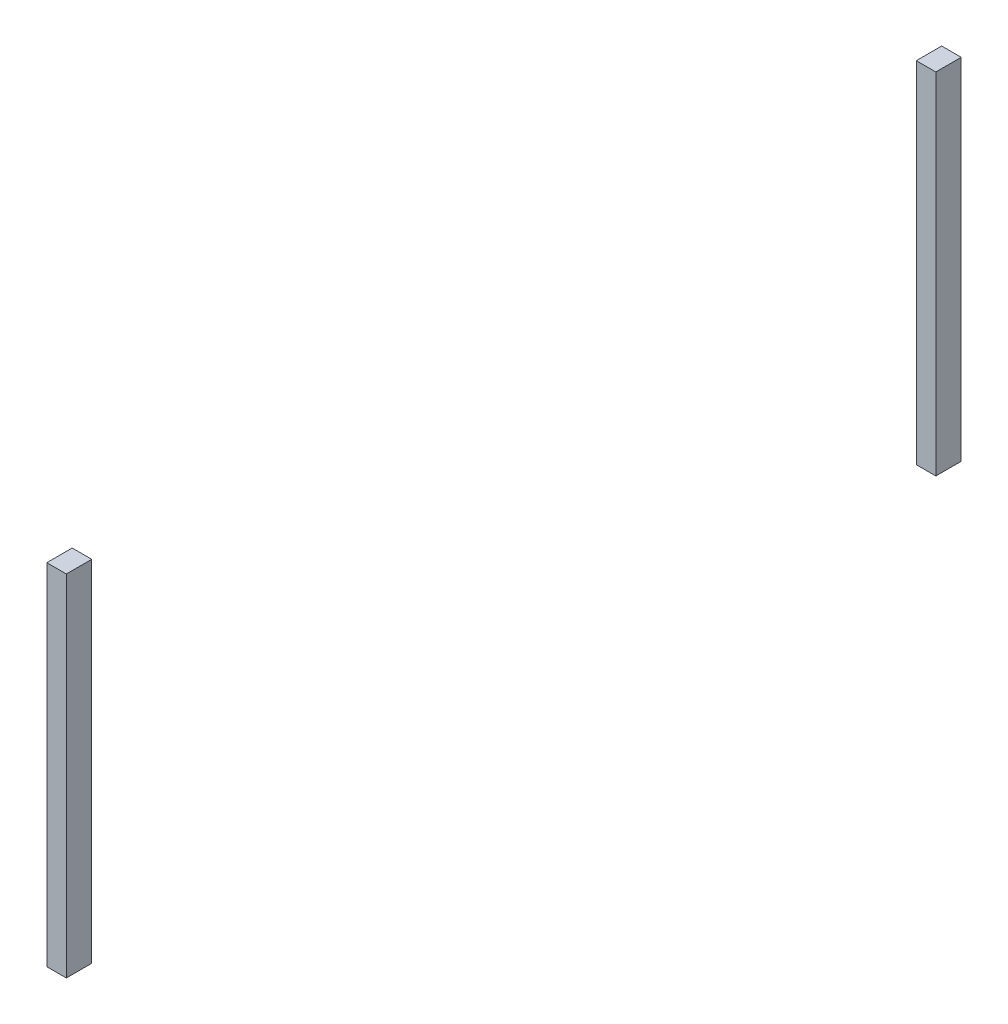
ISO-10303-21;
HEADER;
FILE_DESCRIPTION(('STEP AP214'),'2;1');
FILE_NAME('part.step','',(''),(''),'','','');
FILE_SCHEMA(('AUTOMOTIVE_DESIGN { 1 0 10303 214 1 1 1 1 }'));
ENDSEC;
DATA;
#1=APPLICATION_CONTEXT('core data for automotive mechanical design processes');
#2=APPLICATION_PROTOCOL_DEFINITION('international standard','automotive_design',2000,#1);
#3=PRODUCT_CONTEXT('',#1,'mechanical');
#4=PRODUCT('Part','Part','',(#3));
#5=PRODUCT_RELATED_PRODUCT_CATEGORY('part','',(#4));
#6=PRODUCT_DEFINITION_FORMATION('','',#4);
#7=PRODUCT_DEFINITION_CONTEXT('part definition',#1,'design');
#8=PRODUCT_DEFINITION('design','',#6,#7);
#9=PRODUCT_DEFINITION_SHAPE('','',#8);
#10=(LENGTH_UNIT() NAMED_UNIT(*) SI_UNIT(.MILLI.,.METRE.));
#11=(NAMED_UNIT(*) PLANE_ANGLE_UNIT() SI_UNIT($,.RADIAN.));
#12=(NAMED_UNIT(*) SI_UNIT($,.STERADIAN.) SOLID_ANGLE_UNIT());
#13=UNCERTAINTY_MEASURE_WITH_UNIT(LENGTH_MEASURE(1.E-05),#10,'distance_accuracy_value','');
#14=(GEOMETRIC_REPRESENTATION_CONTEXT(3) GLOBAL_UNCERTAINTY_ASSIGNED_CONTEXT((#13)) GLOBAL_UNIT_ASSIGNED_CONTEXT((#10,
#11,#12)) REPRESENTATION_CONTEXT('',''));
#15=CARTESIAN_POINT('',(0.,0.,0.));
#16=DIRECTION('',(0.,0.,1.));
#17=DIRECTION('',(1.,0.,0.));
#18=AXIS2_PLACEMENT_3D('',#15,#16,#17);
#19=CARTESIAN_POINT('',(287.55,151.,601.6));
#20=DIRECTION('',(0.,1.,0.));
#21=DIRECTION('',(0.,0.,1.));
#22=AXIS2_PLACEMENT_3D('',#19,#20,#21);
#23=PLANE('',#22);
#24=DIRECTION('',(0.,0.,-1.));
#25=VECTOR('',#24,1.);
#26=CARTESIAN_POINT('',(256.75,151.,601.6));
#27=LINE('',#26,#25);
#28=CARTESIAN_POINT('',(256.75,151.,601.6));
#29=VERTEX_POINT('',#28);
#30=CARTESIAN_POINT('',(256.75,151.,561.6));
#31=VERTEX_POINT('',#30);
#32=EDGE_CURVE('E106',#29,#31,#27,.T.);
#33=ORIENTED_EDGE('',*,*,#32,.F.);
#34=DIRECTION('',(-1.,0.,0.));
#35=VECTOR('',#34,1.);
#36=CARTESIAN_POINT('',(287.55,151.,601.6));
#37=LINE('',#36,#35);
#38=CARTESIAN_POINT('',(287.55,151.,601.6));
#39=VERTEX_POINT('',#38);
#40=EDGE_CURVE('E12',#39,#29,#37,.T.);
#41=ORIENTED_EDGE('',*,*,#40,.F.);
#42=DIRECTION('',(0.,0.,-1.));
#43=VECTOR('',#42,1.);
#44=CARTESIAN_POINT('',(287.55,151.,601.6));
#45=LINE('',#44,#43);
#46=CARTESIAN_POINT('',(287.55,151.,561.6));
#47=VERTEX_POINT('',#46);
#48=EDGE_CURVE('E100',#39,#47,#45,.T.);
#49=ORIENTED_EDGE('',*,*,#48,.T.);
#50=DIRECTION('',(-1.,0.,0.));
#51=VECTOR('',#50,1.);
#52=CARTESIAN_POINT('',(287.55,151.,561.6));
#53=LINE('',#52,#51);
#54=EDGE_CURVE('E45',#47,#31,#53,.T.);
#55=ORIENTED_EDGE('',*,*,#54,.T.);
#56=EDGE_LOOP('',(#33,#41,#49,#55));
#57=FACE_BOUND('',#56,.T.);
#58=ADVANCED_FACE('F42',(#57),#23,.T.);
#59=CARTESIAN_POINT('',(287.55,-400.,601.6));
#60=DIRECTION('',(0.,0.,1.));
#61=DIRECTION('',(1.,0.,0.));
#62=AXIS2_PLACEMENT_3D('',#59,#60,#61);
#63=PLANE('',#62);
#64=DIRECTION('',(0.,1.,0.));
#65=VECTOR('',#64,1.);
#66=CARTESIAN_POINT('',(256.75,-400.,601.6));
#67=LINE('',#66,#65);
#68=CARTESIAN_POINT('',(256.75,-400.,601.6));
#69=VERTEX_POINT('',#68);
#70=EDGE_CURVE('E102',#69,#29,#67,.T.);
#71=ORIENTED_EDGE('',*,*,#70,.F.);
#72=DIRECTION('',(-1.,0.,0.));
#73=VECTOR('',#72,1.);
#74=CARTESIAN_POINT('',(287.55,-400.,601.6));
#75=LINE('',#74,#73);
#76=CARTESIAN_POINT('',(287.55,-400.,601.6));
#77=VERTEX_POINT('',#76);
#78=EDGE_CURVE('E51',#77,#69,#75,.T.);
#79=ORIENTED_EDGE('',*,*,#78,.F.);
#80=DIRECTION('',(0.,1.,0.));
#81=VECTOR('',#80,1.);
#82=CARTESIAN_POINT('',(287.55,-400.,601.6));
#83=LINE('',#82,#81);
#84=EDGE_CURVE('E97',#77,#39,#83,.T.);
#85=ORIENTED_EDGE('',*,*,#84,.T.);
#86=ORIENTED_EDGE('',*,*,#40,.T.);
#87=EDGE_LOOP('',(#71,#79,#85,#86));
#88=FACE_BOUND('',#87,.T.);
#89=ADVANCED_FACE('F116',(#88),#63,.T.);
#90=CARTESIAN_POINT('',(287.55,-400.,561.6));
#91=DIRECTION('',(0.,-1.,0.));
#92=DIRECTION('',(0.,0.,-1.));
#93=AXIS2_PLACEMENT_3D('',#90,#91,#92);
#94=PLANE('',#93);
#95=DIRECTION('',(0.,0.,1.));
#96=VECTOR('',#95,1.);
#97=CARTESIAN_POINT('',(256.75,-400.,561.6));
#98=LINE('',#97,#96);
#99=CARTESIAN_POINT('',(256.75,-400.,561.6));
#100=VERTEX_POINT('',#99);
#101=EDGE_CURVE('E92',#100,#69,#98,.T.);
#102=ORIENTED_EDGE('',*,*,#101,.F.);
#103=DIRECTION('',(-1.,0.,0.));
#104=VECTOR('',#103,1.);
#105=CARTESIAN_POINT('',(287.55,-400.,561.6));
#106=LINE('',#105,#104);
#107=CARTESIAN_POINT('',(287.55,-400.,561.6));
#108=VERTEX_POINT('',#107);
#109=EDGE_CURVE('E87',#108,#100,#106,.T.);
#110=ORIENTED_EDGE('',*,*,#109,.F.);
#111=DIRECTION('',(0.,0.,1.));
#112=VECTOR('',#111,1.);
#113=CARTESIAN_POINT('',(287.55,-400.,561.6));
#114=LINE('',#113,#112);
#115=EDGE_CURVE('E90',#108,#77,#114,.T.);
#116=ORIENTED_EDGE('',*,*,#115,.T.);
#117=ORIENTED_EDGE('',*,*,#78,.T.);
#118=EDGE_LOOP('',(#102,#110,#116,#117));
#119=FACE_BOUND('',#118,.T.);
#120=ADVANCED_FACE('F89',(#119),#94,.T.);
#121=CARTESIAN_POINT('',(287.55,151.,561.6));
#122=DIRECTION('',(0.,0.,-1.));
#123=DIRECTION('',(-1.,0.,0.));
#124=AXIS2_PLACEMENT_3D('',#121,#122,#123);
#125=PLANE('',#124);
#126=DIRECTION('',(0.,-1.,0.));
#127=VECTOR('',#126,1.);
#128=CARTESIAN_POINT('',(256.75,151.,561.6));
#129=LINE('',#128,#127);
#130=EDGE_CURVE('E109',#31,#100,#129,.T.);
#131=ORIENTED_EDGE('',*,*,#130,.F.);
#132=ORIENTED_EDGE('',*,*,#54,.F.);
#133=DIRECTION('',(0.,-1.,0.));
#134=VECTOR('',#133,1.);
#135=CARTESIAN_POINT('',(287.55,151.,561.6));
#136=LINE('',#135,#134);
#137=EDGE_CURVE('E96',#47,#108,#136,.T.);
#138=ORIENTED_EDGE('',*,*,#137,.T.);
#139=ORIENTED_EDGE('',*,*,#109,.T.);
#140=EDGE_LOOP('',(#131,#132,#138,#139));
#141=FACE_BOUND('',#140,.T.);
#142=ADVANCED_FACE('F99',(#141),#125,.T.);
#143=CARTESIAN_POINT('',(287.55,0.,0.));
#144=DIRECTION('',(-1.,0.,0.));
#145=DIRECTION('',(0.,0.,1.));
#146=AXIS2_PLACEMENT_3D('',#143,#144,#145);
#147=PLANE('',#146);
#148=ORIENTED_EDGE('',*,*,#48,.F.);
#149=ORIENTED_EDGE('',*,*,#84,.F.);
#150=ORIENTED_EDGE('',*,*,#115,.F.);
#151=ORIENTED_EDGE('',*,*,#137,.F.);
#152=EDGE_LOOP('',(#148,#149,#150,#151));
#153=FACE_BOUND('',#152,.T.);
#154=ADVANCED_FACE('F95',(#153),#147,.F.);
#155=CARTESIAN_POINT('',(256.75,0.,0.));
#156=DIRECTION('',(-1.,0.,0.));
#157=DIRECTION('',(0.,0.,1.));
#158=AXIS2_PLACEMENT_3D('',#155,#156,#157);
#159=PLANE('',#158);
#160=ORIENTED_EDGE('',*,*,#32,.T.);
#161=ORIENTED_EDGE('',*,*,#130,.T.);
#162=ORIENTED_EDGE('',*,*,#101,.T.);
#163=ORIENTED_EDGE('',*,*,#70,.T.);
#164=EDGE_LOOP('',(#160,#161,#162,#163));
#165=FACE_BOUND('',#164,.T.);
#166=ADVANCED_FACE('F115',(#165),#159,.T.);
#167=CLOSED_SHELL('',(#58,#89,#120,#142,#154,#166));
#168=MANIFOLD_SOLID_BREP('B2',#167);
#169=CARTESIAN_POINT('',(287.55,-400.,1970.8));
#170=DIRECTION('',(0.,0.,1.));
#171=DIRECTION('',(1.,0.,0.));
#172=AXIS2_PLACEMENT_3D('',#169,#170,#171);
#173=PLANE('',#172);
#174=DIRECTION('',(0.,1.,0.));
#175=VECTOR('',#174,1.);
#176=CARTESIAN_POINT('',(256.75,-400.,1970.8));
#177=LINE('',#176,#175);
#178=CARTESIAN_POINT('',(256.75,-400.,1970.8));
#179=VERTEX_POINT('',#178);
#180=CARTESIAN_POINT('',(256.75,151.,1970.8));
#181=VERTEX_POINT('',#180);
#182=EDGE_CURVE('E229',#179,#181,#177,.T.);
#183=ORIENTED_EDGE('',*,*,#182,.F.);
#184=DIRECTION('',(-1.,0.,0.));
#185=VECTOR('',#184,1.);
#186=CARTESIAN_POINT('',(287.55,-400.,1970.8));
#187=LINE('',#186,#185);
#188=CARTESIAN_POINT('',(287.55,-400.,1970.8));
#189=VERTEX_POINT('',#188);
#190=EDGE_CURVE('E40',#189,#179,#187,.T.);
#191=ORIENTED_EDGE('',*,*,#190,.F.);
#192=DIRECTION('',(0.,1.,0.));
#193=VECTOR('',#192,1.);
#194=CARTESIAN_POINT('',(287.55,-400.,1970.8));
#195=LINE('',#194,#193);
#196=CARTESIAN_POINT('',(287.55,151.,1970.8));
#197=VERTEX_POINT('',#196);
#198=EDGE_CURVE('E223',#189,#197,#195,.T.);
#199=ORIENTED_EDGE('',*,*,#198,.T.);
#200=DIRECTION('',(-1.,0.,0.));
#201=VECTOR('',#200,1.);
#202=CARTESIAN_POINT('',(287.55,151.,1970.8));
#203=LINE('',#202,#201);
#204=EDGE_CURVE('E168',#197,#181,#203,.T.);
#205=ORIENTED_EDGE('',*,*,#204,.T.);
#206=EDGE_LOOP('',(#183,#191,#199,#205));
#207=FACE_BOUND('',#206,.T.);
#208=ADVANCED_FACE('F165',(#207),#173,.T.);
#209=CARTESIAN_POINT('',(287.55,-400.,1930.8));
#210=DIRECTION('',(0.,-1.,0.));
#211=DIRECTION('',(0.,0.,-1.));
#212=AXIS2_PLACEMENT_3D('',#209,#210,#211);
#213=PLANE('',#212);
#214=DIRECTION('',(0.,0.,1.));
#215=VECTOR('',#214,1.);
#216=CARTESIAN_POINT('',(256.75,-400.,1930.8));
#217=LINE('',#216,#215);
#218=CARTESIAN_POINT('',(256.75,-400.,1930.8));
#219=VERTEX_POINT('',#218);
#220=EDGE_CURVE('E225',#219,#179,#217,.T.);
#221=ORIENTED_EDGE('',*,*,#220,.F.);
#222=DIRECTION('',(-1.,0.,0.));
#223=VECTOR('',#222,1.);
#224=CARTESIAN_POINT('',(287.55,-400.,1930.8));
#225=LINE('',#224,#223);
#226=CARTESIAN_POINT('',(287.55,-400.,1930.8));
#227=VERTEX_POINT('',#226);
#228=EDGE_CURVE('E174',#227,#219,#225,.T.);
#229=ORIENTED_EDGE('',*,*,#228,.F.);
#230=DIRECTION('',(0.,0.,1.));
#231=VECTOR('',#230,1.);
#232=CARTESIAN_POINT('',(287.55,-400.,1930.8));
#233=LINE('',#232,#231);
#234=EDGE_CURVE('E220',#227,#189,#233,.T.);
#235=ORIENTED_EDGE('',*,*,#234,.T.);
#236=ORIENTED_EDGE('',*,*,#190,.T.);
#237=EDGE_LOOP('',(#221,#229,#235,#236));
#238=FACE_BOUND('',#237,.T.);
#239=ADVANCED_FACE('F239',(#238),#213,.T.);
#240=CARTESIAN_POINT('',(287.55,151.,1930.8));
#241=DIRECTION('',(0.,0.,-1.));
#242=DIRECTION('',(-1.,0.,0.));
#243=AXIS2_PLACEMENT_3D('',#240,#241,#242);
#244=PLANE('',#243);
#245=DIRECTION('',(0.,-1.,0.));
#246=VECTOR('',#245,1.);
#247=CARTESIAN_POINT('',(256.75,151.,1930.8));
#248=LINE('',#247,#246);
#249=CARTESIAN_POINT('',(256.75,151.,1930.8));
#250=VERTEX_POINT('',#249);
#251=EDGE_CURVE('E215',#250,#219,#248,.T.);
#252=ORIENTED_EDGE('',*,*,#251,.F.);
#253=DIRECTION('',(-1.,0.,0.));
#254=VECTOR('',#253,1.);
#255=CARTESIAN_POINT('',(287.55,151.,1930.8));
#256=LINE('',#255,#254);
#257=CARTESIAN_POINT('',(287.55,151.,1930.8));
#258=VERTEX_POINT('',#257);
#259=EDGE_CURVE('E210',#258,#250,#256,.T.);
#260=ORIENTED_EDGE('',*,*,#259,.F.);
#261=DIRECTION('',(0.,-1.,0.));
#262=VECTOR('',#261,1.);
#263=CARTESIAN_POINT('',(287.55,151.,1930.8));
#264=LINE('',#263,#262);
#265=EDGE_CURVE('E213',#258,#227,#264,.T.);
#266=ORIENTED_EDGE('',*,*,#265,.T.);
#267=ORIENTED_EDGE('',*,*,#228,.T.);
#268=EDGE_LOOP('',(#252,#260,#266,#267));
#269=FACE_BOUND('',#268,.T.);
#270=ADVANCED_FACE('F212',(#269),#244,.T.);
#271=CARTESIAN_POINT('',(287.55,151.,1970.8));
#272=DIRECTION('',(0.,1.,0.));
#273=DIRECTION('',(0.,0.,1.));
#274=AXIS2_PLACEMENT_3D('',#271,#272,#273);
#275=PLANE('',#274);
#276=DIRECTION('',(0.,0.,-1.));
#277=VECTOR('',#276,1.);
#278=CARTESIAN_POINT('',(256.75,151.,1970.8));
#279=LINE('',#278,#277);
#280=EDGE_CURVE('E232',#181,#250,#279,.T.);
#281=ORIENTED_EDGE('',*,*,#280,.F.);
#282=ORIENTED_EDGE('',*,*,#204,.F.);
#283=DIRECTION('',(0.,0.,-1.));
#284=VECTOR('',#283,1.);
#285=CARTESIAN_POINT('',(287.55,151.,1970.8));
#286=LINE('',#285,#284);
#287=EDGE_CURVE('E219',#197,#258,#286,.T.);
#288=ORIENTED_EDGE('',*,*,#287,.T.);
#289=ORIENTED_EDGE('',*,*,#259,.T.);
#290=EDGE_LOOP('',(#281,#282,#288,#289));
#291=FACE_BOUND('',#290,.T.);
#292=ADVANCED_FACE('F222',(#291),#275,.T.);
#293=CARTESIAN_POINT('',(287.55,0.,0.));
#294=DIRECTION('',(-1.,0.,0.));
#295=DIRECTION('',(0.,0.,1.));
#296=AXIS2_PLACEMENT_3D('',#293,#294,#295);
#297=PLANE('',#296);
#298=ORIENTED_EDGE('',*,*,#198,.F.);
#299=ORIENTED_EDGE('',*,*,#234,.F.);
#300=ORIENTED_EDGE('',*,*,#265,.F.);
#301=ORIENTED_EDGE('',*,*,#287,.F.);
#302=EDGE_LOOP('',(#298,#299,#300,#301));
#303=FACE_BOUND('',#302,.T.);
#304=ADVANCED_FACE('F218',(#303),#297,.F.);
#305=CARTESIAN_POINT('',(256.75,0.,0.));
#306=DIRECTION('',(-1.,0.,0.));
#307=DIRECTION('',(0.,0.,1.));
#308=AXIS2_PLACEMENT_3D('',#305,#306,#307);
#309=PLANE('',#308);
#310=ORIENTED_EDGE('',*,*,#182,.T.);
#311=ORIENTED_EDGE('',*,*,#280,.T.);
#312=ORIENTED_EDGE('',*,*,#251,.T.);
#313=ORIENTED_EDGE('',*,*,#220,.T.);
#314=EDGE_LOOP('',(#310,#311,#312,#313));
#315=FACE_BOUND('',#314,.T.);
#316=ADVANCED_FACE('F238',(#315),#309,.T.);
#317=CLOSED_SHELL('',(#208,#239,#270,#292,#304,#316));
#318=MANIFOLD_SOLID_BREP('B6',#317);
#319=ADVANCED_BREP_SHAPE_REPRESENTATION('',(#18,#168,#318),#14);
#320=SHAPE_DEFINITION_REPRESENTATION(#9,#319);
ENDSEC;
END-ISO-10303-21;
